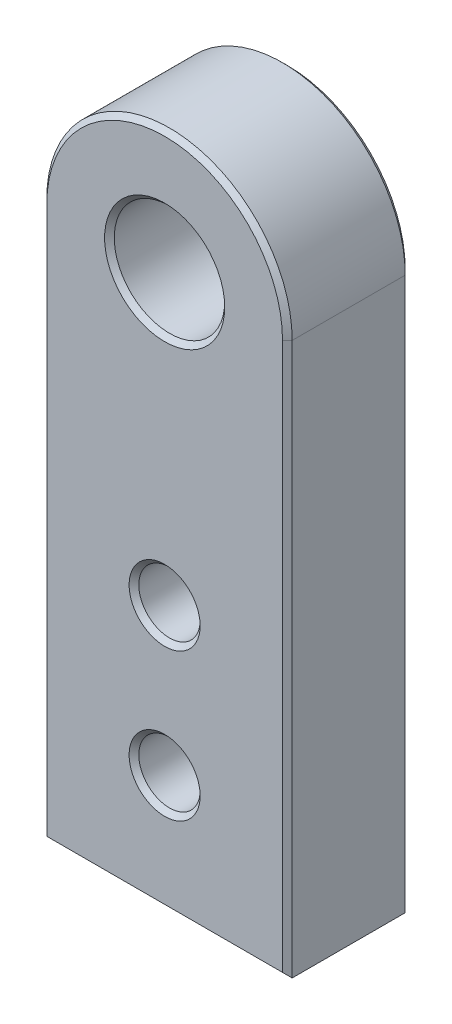
ISO-10303-21;
HEADER;
FILE_DESCRIPTION(('STEP AP214'),'2;1');
FILE_NAME('part.step','',(''),(''),'','','');
FILE_SCHEMA(('AUTOMOTIVE_DESIGN { 1 0 10303 214 1 1 1 1 }'));
ENDSEC;
DATA;
#1=APPLICATION_CONTEXT('core data for automotive mechanical design processes');
#2=APPLICATION_PROTOCOL_DEFINITION('international standard','automotive_design',2000,#1);
#3=PRODUCT_CONTEXT('',#1,'mechanical');
#4=PRODUCT('Part','Part','',(#3));
#5=PRODUCT_RELATED_PRODUCT_CATEGORY('part','',(#4));
#6=PRODUCT_DEFINITION_FORMATION('','',#4);
#7=PRODUCT_DEFINITION_CONTEXT('part definition',#1,'design');
#8=PRODUCT_DEFINITION('design','',#6,#7);
#9=PRODUCT_DEFINITION_SHAPE('','',#8);
#10=(LENGTH_UNIT() NAMED_UNIT(*) SI_UNIT(.MILLI.,.METRE.));
#11=(NAMED_UNIT(*) PLANE_ANGLE_UNIT() SI_UNIT($,.RADIAN.));
#12=(NAMED_UNIT(*) SI_UNIT($,.STERADIAN.) SOLID_ANGLE_UNIT());
#13=UNCERTAINTY_MEASURE_WITH_UNIT(LENGTH_MEASURE(1.E-05),#10,'distance_accuracy_value','');
#14=(GEOMETRIC_REPRESENTATION_CONTEXT(3) GLOBAL_UNCERTAINTY_ASSIGNED_CONTEXT((#13)) GLOBAL_UNIT_ASSIGNED_CONTEXT((#10,
#11,#12)) REPRESENTATION_CONTEXT('',''));
#15=CARTESIAN_POINT('',(0.,0.,0.));
#16=DIRECTION('',(0.,0.,1.));
#17=DIRECTION('',(1.,0.,0.));
#18=AXIS2_PLACEMENT_3D('',#15,#16,#17);
#19=CARTESIAN_POINT('',(12.7,57.15,12.7));
#20=DIRECTION('',(0.,0.,1.));
#21=DIRECTION('',(1.,0.,0.));
#22=AXIS2_PLACEMENT_3D('',#19,#20,#21);
#23=PLANE('',#22);
#24=CARTESIAN_POINT('',(12.7,12.065,12.7));
#25=DIRECTION('',(0.,0.,1.));
#26=DIRECTION('',(1.,0.,0.));
#27=AXIS2_PLACEMENT_3D('',#24,#25,#26);
#28=CIRCLE('',#27,3.675);
#29=CARTESIAN_POINT('',(16.375,12.065,12.7));
#30=VERTEX_POINT('',#29);
#31=EDGE_CURVE('E11',#30,#30,#28,.F.);
#32=ORIENTED_EDGE('',*,*,#31,.T.);
#33=EDGE_LOOP('',(#32));
#34=FACE_BOUND('',#33,.T.);
#35=CARTESIAN_POINT('',(12.7,27.305,12.7));
#36=DIRECTION('',(0.,0.,1.));
#37=DIRECTION('',(1.,0.,0.));
#38=AXIS2_PLACEMENT_3D('',#35,#36,#37);
#39=CIRCLE('',#38,3.675);
#40=CARTESIAN_POINT('',(16.375,27.305,12.7));
#41=VERTEX_POINT('',#40);
#42=EDGE_CURVE('E46',#41,#41,#39,.F.);
#43=ORIENTED_EDGE('',*,*,#42,.T.);
#44=EDGE_LOOP('',(#43));
#45=FACE_BOUND('',#44,.T.);
#46=DIRECTION('',(0.,1.,0.));
#47=VECTOR('',#46,1.);
#48=CARTESIAN_POINT('',(24.9,57.15,12.7));
#49=LINE('',#48,#47);
#50=CARTESIAN_POINT('',(24.9,0.499999999999995,12.7));
#51=VERTEX_POINT('',#50);
#52=CARTESIAN_POINT('',(24.9,57.15,12.7));
#53=VERTEX_POINT('',#52);
#54=EDGE_CURVE('E54',#51,#53,#49,.T.);
#55=ORIENTED_EDGE('',*,*,#54,.T.);
#56=CARTESIAN_POINT('',(12.7,57.15,12.7));
#57=DIRECTION('',(0.,0.,1.));
#58=DIRECTION('',(1.,0.,0.));
#59=AXIS2_PLACEMENT_3D('',#56,#57,#58);
#60=CIRCLE('',#59,12.2);
#61=CARTESIAN_POINT('',(0.499999999999987,57.15,12.7));
#62=VERTEX_POINT('',#61);
#63=EDGE_CURVE('E185',#53,#62,#60,.T.);
#64=ORIENTED_EDGE('',*,*,#63,.T.);
#65=DIRECTION('',(0.,-1.,0.));
#66=VECTOR('',#65,1.);
#67=CARTESIAN_POINT('',(0.500000000000011,0.,12.7));
#68=LINE('',#67,#66);
#69=CARTESIAN_POINT('',(0.50000000000001,0.499999999999992,12.7));
#70=VERTEX_POINT('',#69);
#71=EDGE_CURVE('E181',#62,#70,#68,.T.);
#72=ORIENTED_EDGE('',*,*,#71,.T.);
#73=DIRECTION('',(1.,0.,0.));
#74=VECTOR('',#73,1.);
#75=CARTESIAN_POINT('',(25.4,0.499999999999995,12.7));
#76=LINE('',#75,#74);
#77=EDGE_CURVE('E59',#70,#51,#76,.T.);
#78=ORIENTED_EDGE('',*,*,#77,.T.);
#79=EDGE_LOOP('',(#55,#64,#72,#78));
#80=FACE_BOUND('',#79,.T.);
#81=CARTESIAN_POINT('',(12.7,57.15,12.7));
#82=DIRECTION('',(0.,0.,1.));
#83=DIRECTION('',(1.,0.,0.));
#84=AXIS2_PLACEMENT_3D('',#81,#82,#83);
#85=CIRCLE('',#84,6.215);
#86=CARTESIAN_POINT('',(18.915,57.15,12.7));
#87=VERTEX_POINT('',#86);
#88=EDGE_CURVE('E178',#87,#87,#85,.F.);
#89=ORIENTED_EDGE('',*,*,#88,.T.);
#90=EDGE_LOOP('',(#89));
#91=FACE_BOUND('',#90,.T.);
#92=ADVANCED_FACE('F36',(#34,#45,#80,#91),#23,.T.);
#93=CARTESIAN_POINT('',(12.7,57.15,0.));
#94=DIRECTION('',(0.,0.,1.));
#95=DIRECTION('',(1.,0.,0.));
#96=AXIS2_PLACEMENT_3D('',#93,#94,#95);
#97=PLANE('',#96);
#98=CARTESIAN_POINT('',(12.7,12.065,0.));
#99=DIRECTION('',(0.,0.,1.));
#100=DIRECTION('',(1.,0.,0.));
#101=AXIS2_PLACEMENT_3D('',#98,#99,#100);
#102=CIRCLE('',#101,3.675);
#103=CARTESIAN_POINT('',(16.375,12.065,0.));
#104=VERTEX_POINT('',#103);
#105=EDGE_CURVE('E141',#104,#104,#102,.T.);
#106=ORIENTED_EDGE('',*,*,#105,.T.);
#107=EDGE_LOOP('',(#106));
#108=FACE_BOUND('',#107,.T.);
#109=CARTESIAN_POINT('',(12.7,57.15,0.));
#110=DIRECTION('',(0.,0.,1.));
#111=DIRECTION('',(1.,0.,0.));
#112=AXIS2_PLACEMENT_3D('',#109,#110,#111);
#113=CIRCLE('',#112,6.21500000000001);
#114=CARTESIAN_POINT('',(18.915,57.15,0.));
#115=VERTEX_POINT('',#114);
#116=EDGE_CURVE('E134',#115,#115,#113,.T.);
#117=ORIENTED_EDGE('',*,*,#116,.T.);
#118=EDGE_LOOP('',(#117));
#119=FACE_BOUND('',#118,.T.);
#120=CARTESIAN_POINT('',(12.7,27.305,0.));
#121=DIRECTION('',(0.,0.,1.));
#122=DIRECTION('',(1.,0.,0.));
#123=AXIS2_PLACEMENT_3D('',#120,#121,#122);
#124=CIRCLE('',#123,3.675);
#125=CARTESIAN_POINT('',(16.375,27.305,0.));
#126=VERTEX_POINT('',#125);
#127=EDGE_CURVE('E131',#126,#126,#124,.T.);
#128=ORIENTED_EDGE('',*,*,#127,.T.);
#129=EDGE_LOOP('',(#128));
#130=FACE_BOUND('',#129,.T.);
#131=CARTESIAN_POINT('',(12.7,57.15,0.));
#132=DIRECTION('',(0.,0.,1.));
#133=DIRECTION('',(1.,0.,0.));
#134=AXIS2_PLACEMENT_3D('',#131,#132,#133);
#135=CIRCLE('',#134,12.2);
#136=CARTESIAN_POINT('',(0.499999999999994,57.15,0.));
#137=VERTEX_POINT('',#136);
#138=CARTESIAN_POINT('',(24.9,57.15,0.));
#139=VERTEX_POINT('',#138);
#140=EDGE_CURVE('E130',#137,#139,#135,.F.);
#141=ORIENTED_EDGE('',*,*,#140,.T.);
#142=DIRECTION('',(0.,-1.,0.));
#143=VECTOR('',#142,1.);
#144=CARTESIAN_POINT('',(24.9,57.15,0.));
#145=LINE('',#144,#143);
#146=CARTESIAN_POINT('',(24.9,0.500000000000002,0.));
#147=VERTEX_POINT('',#146);
#148=EDGE_CURVE('E109',#139,#147,#145,.T.);
#149=ORIENTED_EDGE('',*,*,#148,.T.);
#150=DIRECTION('',(-1.,0.,0.));
#151=VECTOR('',#150,1.);
#152=CARTESIAN_POINT('',(12.7,0.5,0.));
#153=LINE('',#152,#151);
#154=CARTESIAN_POINT('',(0.500000000000017,0.499999999999999,0.));
#155=VERTEX_POINT('',#154);
#156=EDGE_CURVE('E119',#147,#155,#153,.T.);
#157=ORIENTED_EDGE('',*,*,#156,.T.);
#158=DIRECTION('',(0.,1.,0.));
#159=VECTOR('',#158,1.);
#160=CARTESIAN_POINT('',(0.499999999999994,57.15,0.));
#161=LINE('',#160,#159);
#162=EDGE_CURVE('E125',#155,#137,#161,.T.);
#163=ORIENTED_EDGE('',*,*,#162,.T.);
#164=EDGE_LOOP('',(#141,#149,#157,#163));
#165=FACE_BOUND('',#164,.T.);
#166=ADVANCED_FACE('F128',(#108,#119,#130,#165),#97,.F.);
#167=CARTESIAN_POINT('',(0.,0.,12.7));
#168=DIRECTION('',(0.,1.,0.));
#169=DIRECTION('',(-1.,0.,0.));
#170=AXIS2_PLACEMENT_3D('',#167,#168,#169);
#171=PLANE('',#170);
#172=DIRECTION('',(0.,0.,-1.));
#173=VECTOR('',#172,1.);
#174=CARTESIAN_POINT('',(0.,0.,12.7));
#175=LINE('',#174,#173);
#176=CARTESIAN_POINT('',(0.,0.,12.2));
#177=VERTEX_POINT('',#176);
#178=CARTESIAN_POINT('',(0.,0.,0.5));
#179=VERTEX_POINT('',#178);
#180=EDGE_CURVE('E126',#177,#179,#175,.T.);
#181=ORIENTED_EDGE('',*,*,#180,.T.);
#182=DIRECTION('',(1.,0.,0.));
#183=VECTOR('',#182,1.);
#184=CARTESIAN_POINT('',(0.,0.,0.5));
#185=LINE('',#184,#183);
#186=CARTESIAN_POINT('',(25.4,0.,0.5));
#187=VERTEX_POINT('',#186);
#188=EDGE_CURVE('E176',#179,#187,#185,.T.);
#189=ORIENTED_EDGE('',*,*,#188,.T.);
#190=DIRECTION('',(0.,0.,-1.));
#191=VECTOR('',#190,1.);
#192=CARTESIAN_POINT('',(25.4,0.,12.7));
#193=LINE('',#192,#191);
#194=CARTESIAN_POINT('',(25.4,0.,12.2));
#195=VERTEX_POINT('',#194);
#196=EDGE_CURVE('E216',#195,#187,#193,.T.);
#197=ORIENTED_EDGE('',*,*,#196,.F.);
#198=DIRECTION('',(-1.,0.,0.));
#199=VECTOR('',#198,1.);
#200=CARTESIAN_POINT('',(0.,0.,12.2));
#201=LINE('',#200,#199);
#202=EDGE_CURVE('E174',#195,#177,#201,.T.);
#203=ORIENTED_EDGE('',*,*,#202,.T.);
#204=EDGE_LOOP('',(#181,#189,#197,#203));
#205=FACE_BOUND('',#204,.T.);
#206=ADVANCED_FACE('F214',(#205),#171,.F.);
#207=CARTESIAN_POINT('',(25.4,57.15,12.7));
#208=DIRECTION('',(-1.,0.,0.));
#209=DIRECTION('',(0.,-1.,0.));
#210=AXIS2_PLACEMENT_3D('',#207,#208,#209);
#211=PLANE('',#210);
#212=ORIENTED_EDGE('',*,*,#196,.T.);
#213=DIRECTION('',(0.,1.,0.));
#214=VECTOR('',#213,1.);
#215=CARTESIAN_POINT('',(25.4,57.15,0.5));
#216=LINE('',#215,#214);
#217=CARTESIAN_POINT('',(25.4,57.15,0.5));
#218=VERTEX_POINT('',#217);
#219=EDGE_CURVE('E112',#187,#218,#216,.T.);
#220=ORIENTED_EDGE('',*,*,#219,.T.);
#221=DIRECTION('',(0.,0.,-1.));
#222=VECTOR('',#221,1.);
#223=CARTESIAN_POINT('',(25.4,57.15,12.7));
#224=LINE('',#223,#222);
#225=CARTESIAN_POINT('',(25.4,57.15,12.2));
#226=VERTEX_POINT('',#225);
#227=EDGE_CURVE('E223',#226,#218,#224,.T.);
#228=ORIENTED_EDGE('',*,*,#227,.F.);
#229=DIRECTION('',(0.,-1.,0.));
#230=VECTOR('',#229,1.);
#231=CARTESIAN_POINT('',(25.4,0.,12.2));
#232=LINE('',#231,#230);
#233=EDGE_CURVE('E162',#226,#195,#232,.T.);
#234=ORIENTED_EDGE('',*,*,#233,.T.);
#235=EDGE_LOOP('',(#212,#220,#228,#234));
#236=FACE_BOUND('',#235,.T.);
#237=ADVANCED_FACE('F236',(#236),#211,.F.);
#238=CARTESIAN_POINT('',(12.7,57.15,12.7));
#239=DIRECTION('',(0.,0.,-1.));
#240=DIRECTION('',(-1.,0.,0.));
#241=AXIS2_PLACEMENT_3D('',#238,#239,#240);
#242=CYLINDRICAL_SURFACE('',#241,12.7);
#243=ORIENTED_EDGE('',*,*,#227,.T.);
#244=CARTESIAN_POINT('',(12.7,57.15,0.5));
#245=DIRECTION('',(0.,0.,1.));
#246=DIRECTION('',(1.,0.,0.));
#247=AXIS2_PLACEMENT_3D('',#244,#245,#246);
#248=CIRCLE('',#247,12.7);
#249=CARTESIAN_POINT('',(0.,57.15,0.5));
#250=VERTEX_POINT('',#249);
#251=EDGE_CURVE('E168',#218,#250,#248,.T.);
#252=ORIENTED_EDGE('',*,*,#251,.T.);
#253=DIRECTION('',(0.,0.,-1.));
#254=VECTOR('',#253,1.);
#255=CARTESIAN_POINT('',(0.,57.15,12.7));
#256=LINE('',#255,#254);
#257=CARTESIAN_POINT('',(0.,57.15,12.2));
#258=VERTEX_POINT('',#257);
#259=EDGE_CURVE('E193',#258,#250,#256,.T.);
#260=ORIENTED_EDGE('',*,*,#259,.F.);
#261=CARTESIAN_POINT('',(12.7,57.15,12.2));
#262=DIRECTION('',(0.,0.,1.));
#263=DIRECTION('',(1.,0.,0.));
#264=AXIS2_PLACEMENT_3D('',#261,#262,#263);
#265=CIRCLE('',#264,12.7);
#266=EDGE_CURVE('E165',#258,#226,#265,.F.);
#267=ORIENTED_EDGE('',*,*,#266,.T.);
#268=EDGE_LOOP('',(#243,#252,#260,#267));
#269=FACE_BOUND('',#268,.T.);
#270=ADVANCED_FACE('F237',(#269),#242,.T.);
#271=CARTESIAN_POINT('',(0.,57.15,12.7));
#272=DIRECTION('',(1.,0.,0.));
#273=DIRECTION('',(0.,1.,0.));
#274=AXIS2_PLACEMENT_3D('',#271,#272,#273);
#275=PLANE('',#274);
#276=ORIENTED_EDGE('',*,*,#259,.T.);
#277=DIRECTION('',(0.,-1.,0.));
#278=VECTOR('',#277,1.);
#279=CARTESIAN_POINT('',(0.,57.15,0.5));
#280=LINE('',#279,#278);
#281=EDGE_CURVE('E172',#250,#179,#280,.T.);
#282=ORIENTED_EDGE('',*,*,#281,.T.);
#283=ORIENTED_EDGE('',*,*,#180,.F.);
#284=DIRECTION('',(0.,1.,0.));
#285=VECTOR('',#284,1.);
#286=CARTESIAN_POINT('',(0.,57.15,12.2));
#287=LINE('',#286,#285);
#288=EDGE_CURVE('E170',#177,#258,#287,.T.);
#289=ORIENTED_EDGE('',*,*,#288,.T.);
#290=EDGE_LOOP('',(#276,#282,#283,#289));
#291=FACE_BOUND('',#290,.T.);
#292=ADVANCED_FACE('F219',(#291),#275,.F.);
#293=CARTESIAN_POINT('',(12.7,27.305,12.7));
#294=DIRECTION('',(0.,0.,-1.));
#295=DIRECTION('',(-1.,0.,0.));
#296=AXIS2_PLACEMENT_3D('',#293,#294,#295);
#297=CYLINDRICAL_SURFACE('',#296,3.175);
#298=CARTESIAN_POINT('',(12.7,27.305,0.500000000000007));
#299=DIRECTION('',(0.,0.,1.));
#300=DIRECTION('',(1.,0.,0.));
#301=AXIS2_PLACEMENT_3D('',#298,#299,#300);
#302=CIRCLE('',#301,3.175);
#303=CARTESIAN_POINT('',(15.875,27.305,0.500000000000007));
#304=VERTEX_POINT('',#303);
#305=EDGE_CURVE('E159',#304,#304,#302,.F.);
#306=ORIENTED_EDGE('',*,*,#305,.T.);
#307=EDGE_LOOP('',(#306));
#308=FACE_BOUND('',#307,.T.);
#309=CARTESIAN_POINT('',(12.7,27.305,12.2));
#310=DIRECTION('',(0.,0.,1.));
#311=DIRECTION('',(1.,0.,0.));
#312=AXIS2_PLACEMENT_3D('',#309,#310,#311);
#313=CIRCLE('',#312,3.175);
#314=CARTESIAN_POINT('',(15.875,27.305,12.2));
#315=VERTEX_POINT('',#314);
#316=EDGE_CURVE('E156',#315,#315,#313,.T.);
#317=ORIENTED_EDGE('',*,*,#316,.T.);
#318=EDGE_LOOP('',(#317));
#319=FACE_BOUND('',#318,.T.);
#320=ADVANCED_FACE('F258',(#308,#319),#297,.F.);
#321=CARTESIAN_POINT('',(12.7,57.15,12.7));
#322=DIRECTION('',(0.,0.,-1.));
#323=DIRECTION('',(-1.,0.,0.));
#324=AXIS2_PLACEMENT_3D('',#321,#322,#323);
#325=CYLINDRICAL_SURFACE('',#324,5.715);
#326=CARTESIAN_POINT('',(12.7,57.15,0.500000000000014));
#327=DIRECTION('',(0.,0.,1.));
#328=DIRECTION('',(1.,0.,0.));
#329=AXIS2_PLACEMENT_3D('',#326,#327,#328);
#330=CIRCLE('',#329,5.715);
#331=CARTESIAN_POINT('',(18.415,57.15,0.500000000000014));
#332=VERTEX_POINT('',#331);
#333=EDGE_CURVE('E153',#332,#332,#330,.F.);
#334=ORIENTED_EDGE('',*,*,#333,.T.);
#335=EDGE_LOOP('',(#334));
#336=FACE_BOUND('',#335,.T.);
#337=CARTESIAN_POINT('',(12.7,57.15,12.2));
#338=DIRECTION('',(0.,0.,1.));
#339=DIRECTION('',(1.,0.,0.));
#340=AXIS2_PLACEMENT_3D('',#337,#338,#339);
#341=CIRCLE('',#340,5.715);
#342=CARTESIAN_POINT('',(18.415,57.15,12.2));
#343=VERTEX_POINT('',#342);
#344=EDGE_CURVE('E150',#343,#343,#341,.T.);
#345=ORIENTED_EDGE('',*,*,#344,.T.);
#346=EDGE_LOOP('',(#345));
#347=FACE_BOUND('',#346,.T.);
#348=ADVANCED_FACE('F255',(#336,#347),#325,.F.);
#349=CARTESIAN_POINT('',(12.7,12.065,12.7));
#350=DIRECTION('',(0.,0.,-1.));
#351=DIRECTION('',(-1.,0.,0.));
#352=AXIS2_PLACEMENT_3D('',#349,#350,#351);
#353=CYLINDRICAL_SURFACE('',#352,3.175);
#354=CARTESIAN_POINT('',(12.7,12.065,0.500000000000007));
#355=DIRECTION('',(0.,0.,1.));
#356=DIRECTION('',(1.,0.,0.));
#357=AXIS2_PLACEMENT_3D('',#354,#355,#356);
#358=CIRCLE('',#357,3.175);
#359=CARTESIAN_POINT('',(15.875,12.065,0.500000000000007));
#360=VERTEX_POINT('',#359);
#361=EDGE_CURVE('E147',#360,#360,#358,.F.);
#362=ORIENTED_EDGE('',*,*,#361,.T.);
#363=EDGE_LOOP('',(#362));
#364=FACE_BOUND('',#363,.T.);
#365=CARTESIAN_POINT('',(12.7,12.065,12.2));
#366=DIRECTION('',(0.,0.,1.));
#367=DIRECTION('',(1.,0.,0.));
#368=AXIS2_PLACEMENT_3D('',#365,#366,#367);
#369=CIRCLE('',#368,3.175);
#370=CARTESIAN_POINT('',(15.875,12.065,12.2));
#371=VERTEX_POINT('',#370);
#372=EDGE_CURVE('E144',#371,#371,#369,.T.);
#373=ORIENTED_EDGE('',*,*,#372,.T.);
#374=EDGE_LOOP('',(#373));
#375=FACE_BOUND('',#374,.T.);
#376=ADVANCED_FACE('F257',(#364,#375),#353,.F.);
#377=CARTESIAN_POINT('',(12.7,12.065,0.));
#378=DIRECTION('',(0.,0.,-1.));
#379=DIRECTION('',(-1.,0.,0.));
#380=AXIS2_PLACEMENT_3D('',#377,#378,#379);
#381=CONICAL_SURFACE('',#380,3.675,0.785398163397444);
#382=ORIENTED_EDGE('',*,*,#361,.F.);
#383=EDGE_LOOP('',(#382));
#384=FACE_BOUND('',#383,.T.);
#385=ORIENTED_EDGE('',*,*,#105,.F.);
#386=EDGE_LOOP('',(#385));
#387=FACE_BOUND('',#386,.T.);
#388=ADVANCED_FACE('F265',(#384,#387),#381,.F.);
#389=CARTESIAN_POINT('',(12.7,57.15,0.));
#390=DIRECTION('',(0.,0.,-1.));
#391=DIRECTION('',(-1.,0.,0.));
#392=AXIS2_PLACEMENT_3D('',#389,#390,#391);
#393=CONICAL_SURFACE('',#392,6.21500000000001,0.785398163397446);
#394=ORIENTED_EDGE('',*,*,#333,.F.);
#395=EDGE_LOOP('',(#394));
#396=FACE_BOUND('',#395,.T.);
#397=ORIENTED_EDGE('',*,*,#116,.F.);
#398=EDGE_LOOP('',(#397));
#399=FACE_BOUND('',#398,.T.);
#400=ADVANCED_FACE('F288',(#396,#399),#393,.F.);
#401=CARTESIAN_POINT('',(12.7,27.305,0.));
#402=DIRECTION('',(0.,0.,-1.));
#403=DIRECTION('',(-1.,0.,0.));
#404=AXIS2_PLACEMENT_3D('',#401,#402,#403);
#405=CONICAL_SURFACE('',#404,3.675,0.785398163397445);
#406=ORIENTED_EDGE('',*,*,#305,.F.);
#407=EDGE_LOOP('',(#406));
#408=FACE_BOUND('',#407,.T.);
#409=ORIENTED_EDGE('',*,*,#127,.F.);
#410=EDGE_LOOP('',(#409));
#411=FACE_BOUND('',#410,.T.);
#412=ADVANCED_FACE('F295',(#408,#411),#405,.F.);
#413=CARTESIAN_POINT('',(0.,57.15,0.5));
#414=DIRECTION('',(0.707106781186547,0.,0.707106781186547));
#415=DIRECTION('',(0.,-1.,0.));
#416=AXIS2_PLACEMENT_3D('',#413,#414,#415);
#417=PLANE('',#416);
#418=DIRECTION('',(-0.707106781186547,0.,0.707106781186547));
#419=VECTOR('',#418,1.);
#420=CARTESIAN_POINT('',(0.499999999999994,57.15,0.));
#421=LINE('',#420,#419);
#422=EDGE_CURVE('E115',#137,#250,#421,.T.);
#423=ORIENTED_EDGE('',*,*,#422,.F.);
#424=ORIENTED_EDGE('',*,*,#162,.F.);
#425=DIRECTION('',(0.577350269189626,0.577350269189625,-0.577350269189626));
#426=VECTOR('',#425,1.);
#427=CARTESIAN_POINT('',(0.,0.,0.5));
#428=LINE('',#427,#426);
#429=EDGE_CURVE('E122',#179,#155,#428,.T.);
#430=ORIENTED_EDGE('',*,*,#429,.F.);
#431=ORIENTED_EDGE('',*,*,#281,.F.);
#432=EDGE_LOOP('',(#423,#424,#430,#431));
#433=FACE_BOUND('',#432,.T.);
#434=ADVANCED_FACE('F228',(#433),#417,.F.);
#435=CARTESIAN_POINT('',(0.,0.,0.5));
#436=DIRECTION('',(0.,0.707106781186549,0.707106781186546));
#437=DIRECTION('',(1.,0.,0.));
#438=AXIS2_PLACEMENT_3D('',#435,#436,#437);
#439=PLANE('',#438);
#440=ORIENTED_EDGE('',*,*,#429,.T.);
#441=ORIENTED_EDGE('',*,*,#156,.F.);
#442=DIRECTION('',(0.577350269189626,-0.577350269189625,0.577350269189626));
#443=VECTOR('',#442,1.);
#444=CARTESIAN_POINT('',(16.9333333333333,8.46666666666665,-7.96666666666668));
#445=LINE('',#444,#443);
#446=EDGE_CURVE('E105',#187,#147,#445,.F.);
#447=ORIENTED_EDGE('',*,*,#446,.F.);
#448=ORIENTED_EDGE('',*,*,#188,.F.);
#449=EDGE_LOOP('',(#440,#441,#447,#448));
#450=FACE_BOUND('',#449,.T.);
#451=ADVANCED_FACE('F120',(#450),#439,.F.);
#452=CARTESIAN_POINT('',(12.7,57.15,0.5));
#453=DIRECTION('',(0.,0.,1.));
#454=DIRECTION('',(1.,0.,0.));
#455=AXIS2_PLACEMENT_3D('',#452,#453,#454);
#456=CONICAL_SURFACE('',#455,12.7,0.785398163397448);
#457=ORIENTED_EDGE('',*,*,#422,.T.);
#458=ORIENTED_EDGE('',*,*,#251,.F.);
#459=DIRECTION('',(0.707106781186547,0.,0.707106781186547));
#460=VECTOR('',#459,1.);
#461=CARTESIAN_POINT('',(24.9,57.15,0.));
#462=LINE('',#461,#460);
#463=EDGE_CURVE('E116',#139,#218,#462,.T.);
#464=ORIENTED_EDGE('',*,*,#463,.F.);
#465=ORIENTED_EDGE('',*,*,#140,.F.);
#466=EDGE_LOOP('',(#457,#458,#464,#465));
#467=FACE_BOUND('',#466,.T.);
#468=ADVANCED_FACE('F231',(#467),#456,.T.);
#469=CARTESIAN_POINT('',(25.4,57.15,0.5));
#470=DIRECTION('',(-0.707106781186547,0.,0.707106781186547));
#471=DIRECTION('',(0.,1.,0.));
#472=AXIS2_PLACEMENT_3D('',#469,#470,#471);
#473=PLANE('',#472);
#474=ORIENTED_EDGE('',*,*,#446,.T.);
#475=ORIENTED_EDGE('',*,*,#148,.F.);
#476=ORIENTED_EDGE('',*,*,#463,.T.);
#477=ORIENTED_EDGE('',*,*,#219,.F.);
#478=EDGE_LOOP('',(#474,#475,#476,#477));
#479=FACE_BOUND('',#478,.T.);
#480=ADVANCED_FACE('F107',(#479),#473,.F.);
#481=CARTESIAN_POINT('',(12.7,12.065,12.2));
#482=DIRECTION('',(0.,0.,1.));
#483=DIRECTION('',(1.,0.,0.));
#484=AXIS2_PLACEMENT_3D('',#481,#482,#483);
#485=CONICAL_SURFACE('',#484,3.175,0.785398163397446);
#486=ORIENTED_EDGE('',*,*,#31,.F.);
#487=EDGE_LOOP('',(#486));
#488=FACE_BOUND('',#487,.T.);
#489=ORIENTED_EDGE('',*,*,#372,.F.);
#490=EDGE_LOOP('',(#489));
#491=FACE_BOUND('',#490,.T.);
#492=ADVANCED_FACE('F310',(#488,#491),#485,.F.);
#493=CARTESIAN_POINT('',(12.7,27.305,12.2));
#494=DIRECTION('',(0.,0.,1.));
#495=DIRECTION('',(1.,0.,0.));
#496=AXIS2_PLACEMENT_3D('',#493,#494,#495);
#497=CONICAL_SURFACE('',#496,3.175,0.785398163397444);
#498=ORIENTED_EDGE('',*,*,#42,.F.);
#499=EDGE_LOOP('',(#498));
#500=FACE_BOUND('',#499,.T.);
#501=ORIENTED_EDGE('',*,*,#316,.F.);
#502=EDGE_LOOP('',(#501));
#503=FACE_BOUND('',#502,.T.);
#504=ADVANCED_FACE('F329',(#500,#503),#497,.F.);
#505=CARTESIAN_POINT('',(12.7,0.499999999999994,12.7));
#506=DIRECTION('',(0.,-0.707106781186554,0.707106781186542));
#507=DIRECTION('',(-1.,0.,0.));
#508=AXIS2_PLACEMENT_3D('',#505,#506,#507);
#509=PLANE('',#508);
#510=DIRECTION('',(0.577350269189624,0.577350269189622,0.577350269189632));
#511=VECTOR('',#510,1.);
#512=CARTESIAN_POINT('',(19.3833333333331,19.3833333333331,31.5833333333334));
#513=LINE('',#512,#511);
#514=EDGE_CURVE('E197',#177,#70,#513,.T.);
#515=ORIENTED_EDGE('',*,*,#514,.F.);
#516=ORIENTED_EDGE('',*,*,#202,.F.);
#517=DIRECTION('',(-0.577350269189624,0.577350269189622,0.577350269189632));
#518=VECTOR('',#517,1.);
#519=CARTESIAN_POINT('',(20.8333333333334,4.56666666666661,16.7666666666667));
#520=LINE('',#519,#518);
#521=EDGE_CURVE('E41',#51,#195,#520,.F.);
#522=ORIENTED_EDGE('',*,*,#521,.F.);
#523=ORIENTED_EDGE('',*,*,#77,.F.);
#524=EDGE_LOOP('',(#515,#516,#522,#523));
#525=FACE_BOUND('',#524,.T.);
#526=ADVANCED_FACE('F209',(#525),#509,.T.);
#527=CARTESIAN_POINT('',(24.9,57.15,12.7));
#528=DIRECTION('',(0.707106781186552,0.,0.707106781186543));
#529=DIRECTION('',(0.,-1.,0.));
#530=AXIS2_PLACEMENT_3D('',#527,#528,#529);
#531=PLANE('',#530);
#532=ORIENTED_EDGE('',*,*,#521,.T.);
#533=ORIENTED_EDGE('',*,*,#233,.F.);
#534=DIRECTION('',(0.707106781186543,0.,-0.707106781186552));
#535=VECTOR('',#534,1.);
#536=CARTESIAN_POINT('',(24.9,57.15,12.7));
#537=LINE('',#536,#535);
#538=EDGE_CURVE('E196',#53,#226,#537,.T.);
#539=ORIENTED_EDGE('',*,*,#538,.F.);
#540=ORIENTED_EDGE('',*,*,#54,.F.);
#541=EDGE_LOOP('',(#532,#533,#539,#540));
#542=FACE_BOUND('',#541,.T.);
#543=ADVANCED_FACE('F206',(#542),#531,.T.);
#544=CARTESIAN_POINT('',(0.499999999999987,57.15,12.7));
#545=DIRECTION('',(-0.707106781186552,0.,0.707106781186543));
#546=DIRECTION('',(0.,1.,0.));
#547=AXIS2_PLACEMENT_3D('',#544,#545,#546);
#548=PLANE('',#547);
#549=ORIENTED_EDGE('',*,*,#514,.T.);
#550=ORIENTED_EDGE('',*,*,#71,.F.);
#551=DIRECTION('',(0.707106781186543,0.,0.707106781186552));
#552=VECTOR('',#551,1.);
#553=CARTESIAN_POINT('',(0.,57.15,12.2));
#554=LINE('',#553,#552);
#555=EDGE_CURVE('E194',#258,#62,#554,.T.);
#556=ORIENTED_EDGE('',*,*,#555,.F.);
#557=ORIENTED_EDGE('',*,*,#288,.F.);
#558=EDGE_LOOP('',(#549,#550,#556,#557));
#559=FACE_BOUND('',#558,.T.);
#560=ADVANCED_FACE('F244',(#559),#548,.T.);
#561=CARTESIAN_POINT('',(12.7,57.15,12.7));
#562=DIRECTION('',(0.,0.,-1.));
#563=DIRECTION('',(-1.,0.,0.));
#564=AXIS2_PLACEMENT_3D('',#561,#562,#563);
#565=CONICAL_SURFACE('',#564,12.2,0.785398163397441);
#566=ORIENTED_EDGE('',*,*,#538,.T.);
#567=ORIENTED_EDGE('',*,*,#266,.F.);
#568=ORIENTED_EDGE('',*,*,#555,.T.);
#569=ORIENTED_EDGE('',*,*,#63,.F.);
#570=EDGE_LOOP('',(#566,#567,#568,#569));
#571=FACE_BOUND('',#570,.T.);
#572=ADVANCED_FACE('F242',(#571),#565,.T.);
#573=CARTESIAN_POINT('',(12.7,57.15,12.2));
#574=DIRECTION('',(0.,0.,1.));
#575=DIRECTION('',(1.,0.,0.));
#576=AXIS2_PLACEMENT_3D('',#573,#574,#575);
#577=CONICAL_SURFACE('',#576,5.715,0.785398163397444);
#578=ORIENTED_EDGE('',*,*,#88,.F.);
#579=EDGE_LOOP('',(#578));
#580=FACE_BOUND('',#579,.T.);
#581=ORIENTED_EDGE('',*,*,#344,.F.);
#582=EDGE_LOOP('',(#581));
#583=FACE_BOUND('',#582,.T.);
#584=ADVANCED_FACE('F39',(#580,#583),#577,.F.);
#585=CLOSED_SHELL('',(#92,#166,#206,#237,#270,#292,#320,#348,#376,#388,#400,#412,#434,#451,#468,
#480,#492,#504,#526,#543,#560,#572,#584));
#586=MANIFOLD_SOLID_BREP('B2',#585);
#587=ADVANCED_BREP_SHAPE_REPRESENTATION('',(#18,#586),#14);
#588=SHAPE_DEFINITION_REPRESENTATION(#9,#587);
ENDSEC;
END-ISO-10303-21;
